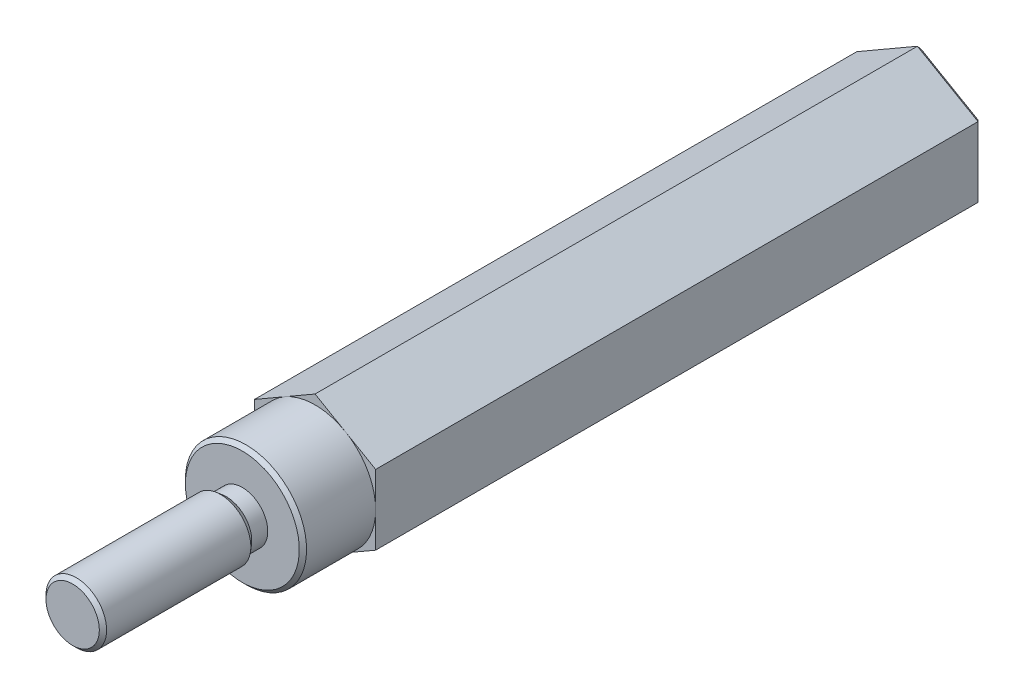
ISO-10303-21;
HEADER;
FILE_DESCRIPTION(('STEP AP214'),'2;1');
FILE_NAME('part.step','',(''),(''),'','','');
FILE_SCHEMA(('AUTOMOTIVE_DESIGN { 1 0 10303 214 1 1 1 1 }'));
ENDSEC;
DATA;
#1=APPLICATION_CONTEXT('core data for automotive mechanical design processes');
#2=APPLICATION_PROTOCOL_DEFINITION('international standard','automotive_design',2000,#1);
#3=PRODUCT_CONTEXT('',#1,'mechanical');
#4=PRODUCT('Part','Part','',(#3));
#5=PRODUCT_RELATED_PRODUCT_CATEGORY('part','',(#4));
#6=PRODUCT_DEFINITION_FORMATION('','',#4);
#7=PRODUCT_DEFINITION_CONTEXT('part definition',#1,'design');
#8=PRODUCT_DEFINITION('design','',#6,#7);
#9=PRODUCT_DEFINITION_SHAPE('','',#8);
#10=(LENGTH_UNIT() NAMED_UNIT(*) SI_UNIT(.MILLI.,.METRE.));
#11=(NAMED_UNIT(*) PLANE_ANGLE_UNIT() SI_UNIT($,.RADIAN.));
#12=(NAMED_UNIT(*) SI_UNIT($,.STERADIAN.) SOLID_ANGLE_UNIT());
#13=UNCERTAINTY_MEASURE_WITH_UNIT(LENGTH_MEASURE(1.E-05),#10,'distance_accuracy_value','');
#14=(GEOMETRIC_REPRESENTATION_CONTEXT(3) GLOBAL_UNCERTAINTY_ASSIGNED_CONTEXT((#13)) GLOBAL_UNIT_ASSIGNED_CONTEXT((#10,
#11,#12)) REPRESENTATION_CONTEXT('',''));
#15=CARTESIAN_POINT('',(0.,0.,0.));
#16=DIRECTION('',(0.,0.,1.));
#17=DIRECTION('',(1.,0.,0.));
#18=AXIS2_PLACEMENT_3D('',#15,#16,#17);
#19=CARTESIAN_POINT('',(4.99999999999997,2.88675134594819,70.));
#20=DIRECTION('',(-0.499999999999995,-0.866025403784442,0.));
#21=DIRECTION('',(0.866025403784442,-0.499999999999995,0.));
#22=AXIS2_PLACEMENT_3D('',#19,#20,#21);
#23=PLANE('',#22);
#24=DIRECTION('',(0.,0.,-1.));
#25=VECTOR('',#24,1.);
#26=CARTESIAN_POINT('',(4.99999999999997,2.88675134594819,70.));
#27=LINE('',#26,#25);
#28=CARTESIAN_POINT('',(4.99999999999997,2.88675134594819,50.));
#29=VERTEX_POINT('',#28);
#30=CARTESIAN_POINT('',(4.99999999999997,2.88675134594819,0.299999999999995));
#31=VERTEX_POINT('',#30);
#32=EDGE_CURVE('E175',#29,#31,#27,.T.);
#33=ORIENTED_EDGE('',*,*,#32,.T.);
#34=DIRECTION('',(-0.866025403784442,0.499999999999995,0.));
#35=VECTOR('',#34,1.);
#36=CARTESIAN_POINT('',(4.99999999999997,2.88675134594819,0.299999999999995));
#37=LINE('',#36,#35);
#38=CARTESIAN_POINT('',(0.,5.77350269189626,0.299999999999995));
#39=VERTEX_POINT('',#38);
#40=EDGE_CURVE('E11',#31,#39,#37,.T.);
#41=ORIENTED_EDGE('',*,*,#40,.T.);
#42=DIRECTION('',(0.,0.,-1.));
#43=VECTOR('',#42,1.);
#44=CARTESIAN_POINT('',(0.,5.77350269189626,70.));
#45=LINE('',#44,#43);
#46=CARTESIAN_POINT('',(0.,5.77350269189626,50.));
#47=VERTEX_POINT('',#46);
#48=EDGE_CURVE('E194',#47,#39,#45,.T.);
#49=ORIENTED_EDGE('',*,*,#48,.F.);
#50=DIRECTION('',(0.866025403784442,-0.499999999999995,0.));
#51=VECTOR('',#50,1.);
#52=CARTESIAN_POINT('',(4.99999999999997,2.88675134594819,50.));
#53=LINE('',#52,#51);
#54=CARTESIAN_POINT('',(2.49999999999998,4.33012701892223,50.));
#55=VERTEX_POINT('',#54);
#56=EDGE_CURVE('E301',#47,#55,#53,.T.);
#57=ORIENTED_EDGE('',*,*,#56,.T.);
#58=EDGE_CURVE('E297',#55,#29,#53,.T.);
#59=ORIENTED_EDGE('',*,*,#58,.T.);
#60=EDGE_LOOP('',(#33,#41,#49,#57,#59));
#61=FACE_BOUND('',#60,.T.);
#62=ADVANCED_FACE('F42',(#61),#23,.F.);
#63=CARTESIAN_POINT('',(0.,5.77350269189626,70.));
#64=DIRECTION('',(0.500000000000001,-0.866025403784438,0.));
#65=DIRECTION('',(0.866025403784438,0.500000000000001,0.));
#66=AXIS2_PLACEMENT_3D('',#63,#64,#65);
#67=PLANE('',#66);
#68=ORIENTED_EDGE('',*,*,#48,.T.);
#69=DIRECTION('',(-0.866025403784438,-0.500000000000001,0.));
#70=VECTOR('',#69,1.);
#71=CARTESIAN_POINT('',(0.,5.77350269189626,0.299999999999995));
#72=LINE('',#71,#70);
#73=CARTESIAN_POINT('',(-5.00000000000001,2.88675134594812,0.299999999999995));
#74=VERTEX_POINT('',#73);
#75=EDGE_CURVE('E219',#39,#74,#72,.T.);
#76=ORIENTED_EDGE('',*,*,#75,.T.);
#77=DIRECTION('',(0.,0.,-1.));
#78=VECTOR('',#77,1.);
#79=CARTESIAN_POINT('',(-5.00000000000001,2.88675134594812,70.));
#80=LINE('',#79,#78);
#81=CARTESIAN_POINT('',(-5.00000000000001,2.88675134594812,50.));
#82=VERTEX_POINT('',#81);
#83=EDGE_CURVE('E191',#82,#74,#80,.T.);
#84=ORIENTED_EDGE('',*,*,#83,.F.);
#85=DIRECTION('',(0.866025403784438,0.500000000000001,0.));
#86=VECTOR('',#85,1.);
#87=CARTESIAN_POINT('',(0.,5.77350269189626,50.));
#88=LINE('',#87,#86);
#89=CARTESIAN_POINT('',(-2.50000000000001,4.33012701892219,50.));
#90=VERTEX_POINT('',#89);
#91=EDGE_CURVE('E142',#82,#90,#88,.T.);
#92=ORIENTED_EDGE('',*,*,#91,.T.);
#93=EDGE_CURVE('E181',#90,#47,#88,.T.);
#94=ORIENTED_EDGE('',*,*,#93,.T.);
#95=EDGE_LOOP('',(#68,#76,#84,#92,#94));
#96=FACE_BOUND('',#95,.T.);
#97=ADVANCED_FACE('F317',(#96),#67,.F.);
#98=CARTESIAN_POINT('',(-5.00000000000001,2.88675134594812,70.));
#99=DIRECTION('',(1.,0.,0.));
#100=DIRECTION('',(0.,1.,0.));
#101=AXIS2_PLACEMENT_3D('',#98,#99,#100);
#102=PLANE('',#101);
#103=ORIENTED_EDGE('',*,*,#83,.T.);
#104=DIRECTION('',(0.,-1.,0.));
#105=VECTOR('',#104,1.);
#106=CARTESIAN_POINT('',(-5.00000000000001,2.88675134594812,0.299999999999995));
#107=LINE('',#106,#105);
#108=CARTESIAN_POINT('',(-4.99999999999999,-2.88675134594815,0.299999999999995));
#109=VERTEX_POINT('',#108);
#110=EDGE_CURVE('E242',#74,#109,#107,.T.);
#111=ORIENTED_EDGE('',*,*,#110,.T.);
#112=DIRECTION('',(0.,0.,-1.));
#113=VECTOR('',#112,1.);
#114=CARTESIAN_POINT('',(-4.99999999999999,-2.88675134594815,70.));
#115=LINE('',#114,#113);
#116=CARTESIAN_POINT('',(-4.99999999999999,-2.88675134594815,50.));
#117=VERTEX_POINT('',#116);
#118=EDGE_CURVE('E173',#117,#109,#115,.T.);
#119=ORIENTED_EDGE('',*,*,#118,.F.);
#120=DIRECTION('',(0.,1.,0.));
#121=VECTOR('',#120,1.);
#122=CARTESIAN_POINT('',(-5.00000000000001,2.88675134594812,50.));
#123=LINE('',#122,#121);
#124=CARTESIAN_POINT('',(-5.,0.,50.));
#125=VERTEX_POINT('',#124);
#126=EDGE_CURVE('E148',#117,#125,#123,.T.);
#127=ORIENTED_EDGE('',*,*,#126,.T.);
#128=EDGE_CURVE('E136',#125,#82,#123,.T.);
#129=ORIENTED_EDGE('',*,*,#128,.T.);
#130=EDGE_LOOP('',(#103,#111,#119,#127,#129));
#131=FACE_BOUND('',#130,.T.);
#132=ADVANCED_FACE('F171',(#131),#102,.F.);
#133=CARTESIAN_POINT('',(-4.99999999999999,-2.88675134594815,70.));
#134=DIRECTION('',(0.499999999999995,0.866025403784442,0.));
#135=DIRECTION('',(-0.866025403784442,0.499999999999995,0.));
#136=AXIS2_PLACEMENT_3D('',#133,#134,#135);
#137=PLANE('',#136);
#138=ORIENTED_EDGE('',*,*,#118,.T.);
#139=DIRECTION('',(0.866025403784442,-0.499999999999995,0.));
#140=VECTOR('',#139,1.);
#141=CARTESIAN_POINT('',(-4.99999999999999,-2.88675134594815,0.299999999999995));
#142=LINE('',#141,#140);
#143=CARTESIAN_POINT('',(0.,-5.77350269189626,0.299999999999995));
#144=VERTEX_POINT('',#143);
#145=EDGE_CURVE('E245',#109,#144,#142,.T.);
#146=ORIENTED_EDGE('',*,*,#145,.T.);
#147=DIRECTION('',(0.,0.,-1.));
#148=VECTOR('',#147,1.);
#149=CARTESIAN_POINT('',(0.,-5.77350269189626,70.));
#150=LINE('',#149,#148);
#151=CARTESIAN_POINT('',(0.,-5.77350269189626,50.));
#152=VERTEX_POINT('',#151);
#153=EDGE_CURVE('E186',#152,#144,#150,.T.);
#154=ORIENTED_EDGE('',*,*,#153,.F.);
#155=DIRECTION('',(-0.866025403784442,0.499999999999995,0.));
#156=VECTOR('',#155,1.);
#157=CARTESIAN_POINT('',(-4.99999999999999,-2.88675134594815,50.));
#158=LINE('',#157,#156);
#159=CARTESIAN_POINT('',(-2.49999999999997,-4.33012701892221,50.));
#160=VERTEX_POINT('',#159);
#161=EDGE_CURVE('E302',#152,#160,#158,.T.);
#162=ORIENTED_EDGE('',*,*,#161,.T.);
#163=EDGE_CURVE('E149',#160,#117,#158,.T.);
#164=ORIENTED_EDGE('',*,*,#163,.T.);
#165=EDGE_LOOP('',(#138,#146,#154,#162,#164));
#166=FACE_BOUND('',#165,.T.);
#167=ADVANCED_FACE('F323',(#166),#137,.F.);
#168=CARTESIAN_POINT('',(0.,-5.77350269189626,70.));
#169=DIRECTION('',(-0.500000000000007,0.866025403784435,0.));
#170=DIRECTION('',(-0.866025403784435,-0.500000000000007,0.));
#171=AXIS2_PLACEMENT_3D('',#168,#169,#170);
#172=PLANE('',#171);
#173=ORIENTED_EDGE('',*,*,#153,.T.);
#174=DIRECTION('',(0.866025403784435,0.500000000000007,0.));
#175=VECTOR('',#174,1.);
#176=CARTESIAN_POINT('',(0.,-5.77350269189626,0.299999999999995));
#177=LINE('',#176,#175);
#178=CARTESIAN_POINT('',(5.00000000000003,-2.88675134594808,0.299999999999995));
#179=VERTEX_POINT('',#178);
#180=EDGE_CURVE('E68',#144,#179,#177,.T.);
#181=ORIENTED_EDGE('',*,*,#180,.T.);
#182=DIRECTION('',(0.,0.,-1.));
#183=VECTOR('',#182,1.);
#184=CARTESIAN_POINT('',(5.00000000000003,-2.88675134594808,70.));
#185=LINE('',#184,#183);
#186=CARTESIAN_POINT('',(5.00000000000003,-2.88675134594808,50.));
#187=VERTEX_POINT('',#186);
#188=EDGE_CURVE('E178',#187,#179,#185,.T.);
#189=ORIENTED_EDGE('',*,*,#188,.F.);
#190=DIRECTION('',(-0.866025403784435,-0.500000000000007,0.));
#191=VECTOR('',#190,1.);
#192=CARTESIAN_POINT('',(0.,-5.77350269189626,50.));
#193=LINE('',#192,#191);
#194=CARTESIAN_POINT('',(2.50000000000003,-4.33012701892217,50.));
#195=VERTEX_POINT('',#194);
#196=EDGE_CURVE('E169',#187,#195,#193,.T.);
#197=ORIENTED_EDGE('',*,*,#196,.T.);
#198=EDGE_CURVE('E298',#195,#152,#193,.T.);
#199=ORIENTED_EDGE('',*,*,#198,.T.);
#200=EDGE_LOOP('',(#173,#181,#189,#197,#199));
#201=FACE_BOUND('',#200,.T.);
#202=ADVANCED_FACE('F387',(#201),#172,.F.);
#203=CARTESIAN_POINT('',(5.00000000000003,-2.88675134594808,70.));
#204=DIRECTION('',(-1.,0.,0.));
#205=DIRECTION('',(0.,-1.,0.));
#206=AXIS2_PLACEMENT_3D('',#203,#204,#205);
#207=PLANE('',#206);
#208=ORIENTED_EDGE('',*,*,#188,.T.);
#209=DIRECTION('',(0.,1.,0.));
#210=VECTOR('',#209,1.);
#211=CARTESIAN_POINT('',(5.00000000000003,-2.88675134594808,0.299999999999995));
#212=LINE('',#211,#210);
#213=EDGE_CURVE('E53',#179,#31,#212,.T.);
#214=ORIENTED_EDGE('',*,*,#213,.T.);
#215=ORIENTED_EDGE('',*,*,#32,.F.);
#216=DIRECTION('',(0.,-1.,0.));
#217=VECTOR('',#216,1.);
#218=CARTESIAN_POINT('',(5.00000000000003,-2.88675134594808,50.));
#219=LINE('',#218,#217);
#220=CARTESIAN_POINT('',(5.,0.,50.));
#221=VERTEX_POINT('',#220);
#222=EDGE_CURVE('E202',#29,#221,#219,.T.);
#223=ORIENTED_EDGE('',*,*,#222,.T.);
#224=EDGE_CURVE('E198',#221,#187,#219,.T.);
#225=ORIENTED_EDGE('',*,*,#224,.T.);
#226=EDGE_LOOP('',(#208,#214,#215,#223,#225));
#227=FACE_BOUND('',#226,.T.);
#228=ADVANCED_FACE('F344',(#227),#207,.F.);
#229=CARTESIAN_POINT('',(0.,0.,0.));
#230=DIRECTION('',(0.,0.,1.));
#231=DIRECTION('',(1.,0.,0.));
#232=AXIS2_PLACEMENT_3D('',#229,#230,#231);
#233=PLANE('',#232);
#234=DIRECTION('',(0.,1.,0.));
#235=VECTOR('',#234,1.);
#236=CARTESIAN_POINT('',(-4.69999999999999,0.,0.));
#237=LINE('',#236,#235);
#238=CARTESIAN_POINT('',(-4.69999999999999,-2.71354626519126,0.));
#239=VERTEX_POINT('',#238);
#240=CARTESIAN_POINT('',(-4.7,2.71354626519123,0.));
#241=VERTEX_POINT('',#240);
#242=EDGE_CURVE('E235',#239,#241,#237,.T.);
#243=ORIENTED_EDGE('',*,*,#242,.T.);
#244=DIRECTION('',(0.866025403784438,0.500000000000001,0.));
#245=VECTOR('',#244,1.);
#246=CARTESIAN_POINT('',(-2.35,4.07031939778686,0.));
#247=LINE('',#246,#245);
#248=CARTESIAN_POINT('',(0.,5.42709253038248,0.));
#249=VERTEX_POINT('',#248);
#250=EDGE_CURVE('E238',#241,#249,#247,.T.);
#251=ORIENTED_EDGE('',*,*,#250,.T.);
#252=DIRECTION('',(0.866025403784442,-0.499999999999995,0.));
#253=VECTOR('',#252,1.);
#254=CARTESIAN_POINT('',(2.34999999999998,4.07031939778689,0.));
#255=LINE('',#254,#253);
#256=CARTESIAN_POINT('',(4.69999999999997,2.71354626519129,0.));
#257=VERTEX_POINT('',#256);
#258=EDGE_CURVE('E223',#249,#257,#255,.T.);
#259=ORIENTED_EDGE('',*,*,#258,.T.);
#260=DIRECTION('',(0.,-1.,0.));
#261=VECTOR('',#260,1.);
#262=CARTESIAN_POINT('',(4.7,0.,0.));
#263=LINE('',#262,#261);
#264=CARTESIAN_POINT('',(4.70000000000002,-2.7135462651912,0.));
#265=VERTEX_POINT('',#264);
#266=EDGE_CURVE('E226',#257,#265,#263,.T.);
#267=ORIENTED_EDGE('',*,*,#266,.T.);
#268=DIRECTION('',(-0.866025403784435,-0.500000000000007,0.));
#269=VECTOR('',#268,1.);
#270=CARTESIAN_POINT('',(2.35000000000003,-4.07031939778684,0.));
#271=LINE('',#270,#269);
#272=CARTESIAN_POINT('',(0.,-5.42709253038248,0.));
#273=VERTEX_POINT('',#272);
#274=EDGE_CURVE('E229',#265,#273,#271,.T.);
#275=ORIENTED_EDGE('',*,*,#274,.T.);
#276=DIRECTION('',(-0.866025403784442,0.499999999999995,0.));
#277=VECTOR('',#276,1.);
#278=CARTESIAN_POINT('',(-2.34999999999997,-4.07031939778687,0.));
#279=LINE('',#278,#277);
#280=EDGE_CURVE('E232',#273,#239,#279,.T.);
#281=ORIENTED_EDGE('',*,*,#280,.T.);
#282=EDGE_LOOP('',(#243,#251,#259,#267,#275,#281));
#283=FACE_BOUND('',#282,.T.);
#284=ADVANCED_FACE('F330',(#283),#233,.F.);
#285=CARTESIAN_POINT('',(0.,0.,56.7166659767547));
#286=DIRECTION('',(0.,0.,-1.));
#287=DIRECTION('',(-1.,0.,0.));
#288=AXIS2_PLACEMENT_3D('',#285,#286,#287);
#289=CYLINDRICAL_SURFACE('',#288,5.);
#290=CARTESIAN_POINT('',(0.,0.,55.7));
#291=DIRECTION('',(0.,0.,-1.));
#292=DIRECTION('',(-1.,0.,0.));
#293=AXIS2_PLACEMENT_3D('',#290,#291,#292);
#294=CIRCLE('',#293,5.);
#295=CARTESIAN_POINT('',(-5.,0.,55.7));
#296=VERTEX_POINT('',#295);
#297=EDGE_CURVE('E203',#296,#296,#294,.T.);
#298=ORIENTED_EDGE('',*,*,#297,.T.);
#299=EDGE_LOOP('',(#298));
#300=FACE_BOUND('',#299,.T.);
#301=CARTESIAN_POINT('',(0.,0.,50.));
#302=DIRECTION('',(0.,0.,-1.));
#303=DIRECTION('',(-1.,0.,0.));
#304=AXIS2_PLACEMENT_3D('',#301,#302,#303);
#305=CIRCLE('',#304,5.);
#306=EDGE_CURVE('E167',#90,#55,#305,.T.);
#307=ORIENTED_EDGE('',*,*,#306,.F.);
#308=EDGE_CURVE('E140',#125,#90,#305,.T.);
#309=ORIENTED_EDGE('',*,*,#308,.F.);
#310=EDGE_CURVE('E153',#160,#125,#305,.T.);
#311=ORIENTED_EDGE('',*,*,#310,.F.);
#312=EDGE_CURVE('E160',#195,#160,#305,.T.);
#313=ORIENTED_EDGE('',*,*,#312,.F.);
#314=EDGE_CURVE('E376',#221,#195,#305,.T.);
#315=ORIENTED_EDGE('',*,*,#314,.F.);
#316=EDGE_CURVE('E373',#55,#221,#305,.T.);
#317=ORIENTED_EDGE('',*,*,#316,.F.);
#318=EDGE_LOOP('',(#307,#309,#311,#313,#315,#317));
#319=FACE_BOUND('',#318,.T.);
#320=ADVANCED_FACE('F164',(#300,#319),#289,.T.);
#321=CARTESIAN_POINT('',(0.,5.,50.));
#322=DIRECTION('',(0.,0.,-1.));
#323=DIRECTION('',(-1.,0.,0.));
#324=AXIS2_PLACEMENT_3D('',#321,#322,#323);
#325=PLANE('',#324);
#326=ORIENTED_EDGE('',*,*,#163,.F.);
#327=ORIENTED_EDGE('',*,*,#310,.T.);
#328=ORIENTED_EDGE('',*,*,#126,.F.);
#329=EDGE_LOOP('',(#326,#327,#328));
#330=FACE_BOUND('',#329,.T.);
#331=ADVANCED_FACE('F154',(#330),#325,.F.);
#332=ORIENTED_EDGE('',*,*,#308,.T.);
#333=ORIENTED_EDGE('',*,*,#91,.F.);
#334=ORIENTED_EDGE('',*,*,#128,.F.);
#335=EDGE_LOOP('',(#332,#333,#334));
#336=FACE_BOUND('',#335,.T.);
#337=ADVANCED_FACE('F138',(#336),#325,.F.);
#338=ORIENTED_EDGE('',*,*,#306,.T.);
#339=ORIENTED_EDGE('',*,*,#56,.F.);
#340=ORIENTED_EDGE('',*,*,#93,.F.);
#341=EDGE_LOOP('',(#338,#339,#340));
#342=FACE_BOUND('',#341,.T.);
#343=ADVANCED_FACE('F511',(#342),#325,.F.);
#344=ORIENTED_EDGE('',*,*,#198,.F.);
#345=ORIENTED_EDGE('',*,*,#312,.T.);
#346=ORIENTED_EDGE('',*,*,#161,.F.);
#347=EDGE_LOOP('',(#344,#345,#346));
#348=FACE_BOUND('',#347,.T.);
#349=ADVANCED_FACE('F386',(#348),#325,.F.);
#350=ORIENTED_EDGE('',*,*,#316,.T.);
#351=ORIENTED_EDGE('',*,*,#222,.F.);
#352=ORIENTED_EDGE('',*,*,#58,.F.);
#353=EDGE_LOOP('',(#350,#351,#352));
#354=FACE_BOUND('',#353,.T.);
#355=ADVANCED_FACE('F372',(#354),#325,.F.);
#356=ORIENTED_EDGE('',*,*,#224,.F.);
#357=ORIENTED_EDGE('',*,*,#314,.T.);
#358=ORIENTED_EDGE('',*,*,#196,.F.);
#359=EDGE_LOOP('',(#356,#357,#358));
#360=FACE_BOUND('',#359,.T.);
#361=ADVANCED_FACE('F388',(#360),#325,.F.);
#362=CARTESIAN_POINT('',(0.,2.5,56.));
#363=DIRECTION('',(0.,0.,-1.));
#364=DIRECTION('',(-1.,0.,0.));
#365=AXIS2_PLACEMENT_3D('',#362,#363,#364);
#366=PLANE('',#365);
#367=CARTESIAN_POINT('',(0.,0.,56.));
#368=DIRECTION('',(0.,0.,-1.));
#369=DIRECTION('',(-1.,0.,0.));
#370=AXIS2_PLACEMENT_3D('',#367,#368,#369);
#371=CIRCLE('',#370,4.70000000000002);
#372=CARTESIAN_POINT('',(-4.70000000000002,0.,56.));
#373=VERTEX_POINT('',#372);
#374=EDGE_CURVE('E207',#373,#373,#371,.F.);
#375=ORIENTED_EDGE('',*,*,#374,.T.);
#376=EDGE_LOOP('',(#375));
#377=FACE_BOUND('',#376,.T.);
#378=CARTESIAN_POINT('',(0.,0.,56.));
#379=DIRECTION('',(0.,0.,-1.));
#380=DIRECTION('',(-1.,0.,0.));
#381=AXIS2_PLACEMENT_3D('',#378,#379,#380);
#382=CIRCLE('',#381,2.1);
#383=CARTESIAN_POINT('',(-2.1,0.,56.));
#384=VERTEX_POINT('',#383);
#385=EDGE_CURVE('E275',#384,#384,#382,.T.);
#386=ORIENTED_EDGE('',*,*,#385,.T.);
#387=EDGE_LOOP('',(#386));
#388=FACE_BOUND('',#387,.T.);
#389=ADVANCED_FACE('F390',(#377,#388),#366,.F.);
#390=CARTESIAN_POINT('',(0.,0.,55.7));
#391=DIRECTION('',(0.,0.,-1.));
#392=DIRECTION('',(-1.,0.,0.));
#393=AXIS2_PLACEMENT_3D('',#390,#391,#392);
#394=CONICAL_SURFACE('',#393,5.,0.785398163397453);
#395=ORIENTED_EDGE('',*,*,#374,.F.);
#396=EDGE_LOOP('',(#395));
#397=FACE_BOUND('',#396,.T.);
#398=ORIENTED_EDGE('',*,*,#297,.F.);
#399=EDGE_LOOP('',(#398));
#400=FACE_BOUND('',#399,.T.);
#401=ADVANCED_FACE('F396',(#397,#400),#394,.T.);
#402=CARTESIAN_POINT('',(0.,0.,57.8));
#403=DIRECTION('',(0.,0.,1.));
#404=DIRECTION('',(1.,0.,0.));
#405=AXIS2_PLACEMENT_3D('',#402,#403,#404);
#406=CONICAL_SURFACE('',#405,2.5,0.698131700797723);
#407=CARTESIAN_POINT('',(0.,0.,57.3232985629623));
#408=DIRECTION('',(0.,0.,-1.));
#409=DIRECTION('',(-1.,0.,0.));
#410=AXIS2_PLACEMENT_3D('',#407,#408,#409);
#411=CIRCLE('',#410,2.1);
#412=CARTESIAN_POINT('',(-2.1,0.,57.3232985629623));
#413=VERTEX_POINT('',#412);
#414=EDGE_CURVE('E282',#413,#413,#411,.T.);
#415=ORIENTED_EDGE('',*,*,#414,.F.);
#416=EDGE_LOOP('',(#415));
#417=FACE_BOUND('',#416,.T.);
#418=CARTESIAN_POINT('',(0.,0.,57.8));
#419=DIRECTION('',(0.,0.,-1.));
#420=DIRECTION('',(-1.,0.,0.));
#421=AXIS2_PLACEMENT_3D('',#418,#419,#420);
#422=CIRCLE('',#421,2.5);
#423=CARTESIAN_POINT('',(-2.5,0.,57.8));
#424=VERTEX_POINT('',#423);
#425=EDGE_CURVE('E161',#424,#424,#422,.T.);
#426=ORIENTED_EDGE('',*,*,#425,.T.);
#427=EDGE_LOOP('',(#426));
#428=FACE_BOUND('',#427,.T.);
#429=ADVANCED_FACE('F416',(#417,#428),#406,.T.);
#430=CARTESIAN_POINT('',(0.,0.,56.));
#431=DIRECTION('',(0.,0.,-1.));
#432=DIRECTION('',(-1.,0.,0.));
#433=AXIS2_PLACEMENT_3D('',#430,#431,#432);
#434=CYLINDRICAL_SURFACE('',#433,2.1);
#435=ORIENTED_EDGE('',*,*,#385,.F.);
#436=EDGE_LOOP('',(#435));
#437=FACE_BOUND('',#436,.T.);
#438=ORIENTED_EDGE('',*,*,#414,.T.);
#439=EDGE_LOOP('',(#438));
#440=FACE_BOUND('',#439,.T.);
#441=ADVANCED_FACE('F465',(#437,#440),#434,.T.);
#442=CARTESIAN_POINT('',(0.,0.,70.));
#443=DIRECTION('',(0.,0.,1.));
#444=DIRECTION('',(1.,0.,0.));
#445=AXIS2_PLACEMENT_3D('',#442,#443,#444);
#446=PLANE('',#445);
#447=CARTESIAN_POINT('',(0.,0.,70.));
#448=DIRECTION('',(0.,0.,1.));
#449=DIRECTION('',(1.,0.,0.));
#450=AXIS2_PLACEMENT_3D('',#447,#448,#449);
#451=CIRCLE('',#450,2.2);
#452=CARTESIAN_POINT('',(2.2,0.,70.));
#453=VERTEX_POINT('',#452);
#454=EDGE_CURVE('E215',#453,#453,#451,.T.);
#455=ORIENTED_EDGE('',*,*,#454,.T.);
#456=EDGE_LOOP('',(#455));
#457=FACE_BOUND('',#456,.T.);
#458=ADVANCED_FACE('F424',(#457),#446,.T.);
#459=CARTESIAN_POINT('',(0.,0.,69.7));
#460=DIRECTION('',(0.,0.,-1.));
#461=DIRECTION('',(-1.,0.,0.));
#462=AXIS2_PLACEMENT_3D('',#459,#460,#461);
#463=CONICAL_SURFACE('',#462,2.5,0.785398163397453);
#464=ORIENTED_EDGE('',*,*,#454,.F.);
#465=EDGE_LOOP('',(#464));
#466=FACE_BOUND('',#465,.T.);
#467=CARTESIAN_POINT('',(0.,0.,69.7));
#468=DIRECTION('',(0.,0.,1.));
#469=DIRECTION('',(1.,0.,0.));
#470=AXIS2_PLACEMENT_3D('',#467,#468,#469);
#471=CIRCLE('',#470,2.5);
#472=CARTESIAN_POINT('',(2.5,0.,69.7));
#473=VERTEX_POINT('',#472);
#474=EDGE_CURVE('E211',#473,#473,#471,.F.);
#475=ORIENTED_EDGE('',*,*,#474,.F.);
#476=EDGE_LOOP('',(#475));
#477=FACE_BOUND('',#476,.T.);
#478=ADVANCED_FACE('F418',(#466,#477),#463,.T.);
#479=CARTESIAN_POINT('',(0.,0.,56.7166659767547));
#480=DIRECTION('',(0.,0.,-1.));
#481=DIRECTION('',(-1.,0.,0.));
#482=AXIS2_PLACEMENT_3D('',#479,#480,#481);
#483=CYLINDRICAL_SURFACE('',#482,2.5);
#484=ORIENTED_EDGE('',*,*,#425,.F.);
#485=EDGE_LOOP('',(#484));
#486=FACE_BOUND('',#485,.T.);
#487=ORIENTED_EDGE('',*,*,#474,.T.);
#488=EDGE_LOOP('',(#487));
#489=FACE_BOUND('',#488,.T.);
#490=ADVANCED_FACE('F423',(#486,#489),#483,.T.);
#491=CARTESIAN_POINT('',(0.,-5.77350269189626,0.299999999999995));
#492=DIRECTION('',(-0.353553390593273,0.612372435695782,0.707106781186559));
#493=DIRECTION('',(0.866025403784435,0.500000000000007,0.));
#494=AXIS2_PLACEMENT_3D('',#491,#492,#493);
#495=PLANE('',#494);
#496=DIRECTION('',(0.,0.755928946018465,-0.654653670707965));
#497=VECTOR('',#496,1.);
#498=CARTESIAN_POINT('',(0.,-5.77350269189626,0.299999999999995));
#499=LINE('',#498,#497);
#500=EDGE_CURVE('E265',#273,#144,#499,.F.);
#501=ORIENTED_EDGE('',*,*,#500,.F.);
#502=ORIENTED_EDGE('',*,*,#274,.F.);
#503=DIRECTION('',(-0.654653670707989,0.377964473009227,-0.654653670707965));
#504=VECTOR('',#503,1.);
#505=CARTESIAN_POINT('',(5.00000000000003,-2.88675134594808,0.299999999999995));
#506=LINE('',#505,#504);
#507=EDGE_CURVE('E47',#179,#265,#506,.T.);
#508=ORIENTED_EDGE('',*,*,#507,.F.);
#509=ORIENTED_EDGE('',*,*,#180,.F.);
#510=EDGE_LOOP('',(#501,#502,#508,#509));
#511=FACE_BOUND('',#510,.T.);
#512=ADVANCED_FACE('F45',(#511),#495,.F.);
#513=CARTESIAN_POINT('',(5.00000000000003,-2.88675134594808,0.299999999999995));
#514=DIRECTION('',(-0.707106781186537,0.,0.707106781186558));
#515=DIRECTION('',(0.,1.,0.));
#516=AXIS2_PLACEMENT_3D('',#513,#514,#515);
#517=PLANE('',#516);
#518=ORIENTED_EDGE('',*,*,#507,.T.);
#519=ORIENTED_EDGE('',*,*,#266,.F.);
#520=DIRECTION('',(-0.654653670707981,-0.377964473009241,-0.654653670707965));
#521=VECTOR('',#520,1.);
#522=CARTESIAN_POINT('',(4.99999999999997,2.88675134594819,0.299999999999995));
#523=LINE('',#522,#521);
#524=EDGE_CURVE('E262',#31,#257,#523,.T.);
#525=ORIENTED_EDGE('',*,*,#524,.F.);
#526=ORIENTED_EDGE('',*,*,#213,.F.);
#527=EDGE_LOOP('',(#518,#519,#525,#526));
#528=FACE_BOUND('',#527,.T.);
#529=ADVANCED_FACE('F340',(#528),#517,.F.);
#530=CARTESIAN_POINT('',(-4.99999999999999,-2.88675134594815,0.299999999999995));
#531=DIRECTION('',(0.353553390593264,0.612372435695787,0.707106781186559));
#532=DIRECTION('',(0.866025403784442,-0.499999999999995,0.));
#533=AXIS2_PLACEMENT_3D('',#530,#531,#532);
#534=PLANE('',#533);
#535=ORIENTED_EDGE('',*,*,#500,.T.);
#536=ORIENTED_EDGE('',*,*,#145,.F.);
#537=DIRECTION('',(0.654653670707985,0.377964473009235,-0.654653670707965));
#538=VECTOR('',#537,1.);
#539=CARTESIAN_POINT('',(-4.99999999999999,-2.88675134594815,0.299999999999995));
#540=LINE('',#539,#538);
#541=EDGE_CURVE('E258',#239,#109,#540,.F.);
#542=ORIENTED_EDGE('',*,*,#541,.F.);
#543=ORIENTED_EDGE('',*,*,#280,.F.);
#544=EDGE_LOOP('',(#535,#536,#542,#543));
#545=FACE_BOUND('',#544,.T.);
#546=ADVANCED_FACE('F325',(#545),#534,.F.);
#547=CARTESIAN_POINT('',(4.99999999999997,2.88675134594819,0.299999999999995));
#548=DIRECTION('',(-0.353553390593264,-0.612372435695786,0.70710678118656));
#549=DIRECTION('',(-0.866025403784442,0.499999999999995,0.));
#550=AXIS2_PLACEMENT_3D('',#547,#548,#549);
#551=PLANE('',#550);
#552=ORIENTED_EDGE('',*,*,#524,.T.);
#553=ORIENTED_EDGE('',*,*,#258,.F.);
#554=DIRECTION('',(0.,0.755928946018465,0.654653670707965));
#555=VECTOR('',#554,1.);
#556=CARTESIAN_POINT('',(0.,4.1239304942116,-1.1285714285714));
#557=LINE('',#556,#555);
#558=EDGE_CURVE('E255',#39,#249,#557,.F.);
#559=ORIENTED_EDGE('',*,*,#558,.F.);
#560=ORIENTED_EDGE('',*,*,#40,.F.);
#561=EDGE_LOOP('',(#552,#553,#559,#560));
#562=FACE_BOUND('',#561,.T.);
#563=ADVANCED_FACE('F337',(#562),#551,.F.);
#564=CARTESIAN_POINT('',(-5.00000000000001,2.88675134594812,0.299999999999995));
#565=DIRECTION('',(0.707106781186536,0.,0.707106781186559));
#566=DIRECTION('',(0.,-1.,0.));
#567=AXIS2_PLACEMENT_3D('',#564,#565,#566);
#568=PLANE('',#567);
#569=ORIENTED_EDGE('',*,*,#541,.T.);
#570=ORIENTED_EDGE('',*,*,#110,.F.);
#571=DIRECTION('',(0.654653670707988,-0.377964473009231,-0.654653670707965));
#572=VECTOR('',#571,1.);
#573=CARTESIAN_POINT('',(-5.00000000000001,2.88675134594812,0.299999999999995));
#574=LINE('',#573,#572);
#575=EDGE_CURVE('E252',#241,#74,#574,.F.);
#576=ORIENTED_EDGE('',*,*,#575,.F.);
#577=ORIENTED_EDGE('',*,*,#242,.F.);
#578=EDGE_LOOP('',(#569,#570,#576,#577));
#579=FACE_BOUND('',#578,.T.);
#580=ADVANCED_FACE('F327',(#579),#568,.F.);
#581=CARTESIAN_POINT('',(0.,5.77350269189626,0.299999999999995));
#582=DIRECTION('',(0.353553390593269,-0.612372435695784,0.707106781186559));
#583=DIRECTION('',(-0.866025403784438,-0.500000000000001,0.));
#584=AXIS2_PLACEMENT_3D('',#581,#582,#583);
#585=PLANE('',#584);
#586=ORIENTED_EDGE('',*,*,#558,.T.);
#587=ORIENTED_EDGE('',*,*,#250,.F.);
#588=ORIENTED_EDGE('',*,*,#575,.T.);
#589=ORIENTED_EDGE('',*,*,#75,.F.);
#590=EDGE_LOOP('',(#586,#587,#588,#589));
#591=FACE_BOUND('',#590,.T.);
#592=ADVANCED_FACE('F332',(#591),#585,.F.);
#593=CLOSED_SHELL('',(#62,#97,#132,#167,#202,#228,#284,#320,#331,#337,#343,#349,#355,#361,#389,
#401,#429,#441,#458,#478,#490,#512,#529,#546,#563,#580,#592));
#594=MANIFOLD_SOLID_BREP('B2',#593);
#595=ADVANCED_BREP_SHAPE_REPRESENTATION('',(#18,#594),#14);
#596=SHAPE_DEFINITION_REPRESENTATION(#9,#595);
ENDSEC;
END-ISO-10303-21;
